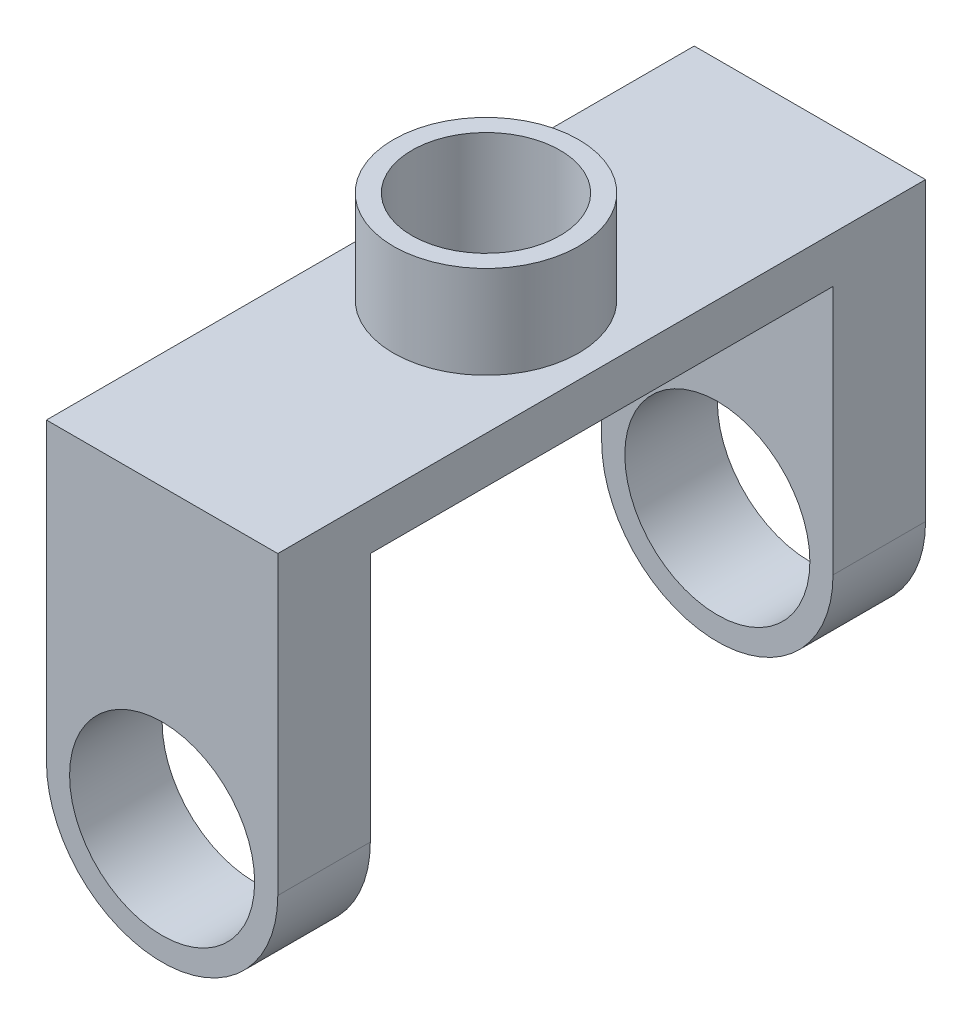
ISO-10303-21;
HEADER;
FILE_DESCRIPTION(('STEP AP214'),'2;1');
FILE_NAME('part.step','',(''),(''),'','','');
FILE_SCHEMA(('AUTOMOTIVE_DESIGN { 1 0 10303 214 1 1 1 1 }'));
ENDSEC;
DATA;
#1=APPLICATION_CONTEXT('core data for automotive mechanical design processes');
#2=APPLICATION_PROTOCOL_DEFINITION('international standard','automotive_design',2000,#1);
#3=PRODUCT_CONTEXT('',#1,'mechanical');
#4=PRODUCT('Part','Part','',(#3));
#5=PRODUCT_RELATED_PRODUCT_CATEGORY('part','',(#4));
#6=PRODUCT_DEFINITION_FORMATION('','',#4);
#7=PRODUCT_DEFINITION_CONTEXT('part definition',#1,'design');
#8=PRODUCT_DEFINITION('design','',#6,#7);
#9=PRODUCT_DEFINITION_SHAPE('','',#8);
#10=(LENGTH_UNIT() NAMED_UNIT(*) SI_UNIT(.MILLI.,.METRE.));
#11=(NAMED_UNIT(*) PLANE_ANGLE_UNIT() SI_UNIT($,.RADIAN.));
#12=(NAMED_UNIT(*) SI_UNIT($,.STERADIAN.) SOLID_ANGLE_UNIT());
#13=UNCERTAINTY_MEASURE_WITH_UNIT(LENGTH_MEASURE(1.E-05),#10,'distance_accuracy_value','');
#14=(GEOMETRIC_REPRESENTATION_CONTEXT(3) GLOBAL_UNCERTAINTY_ASSIGNED_CONTEXT((#13)) GLOBAL_UNIT_ASSIGNED_CONTEXT((#10,
#11,#12)) REPRESENTATION_CONTEXT('',''));
#15=CARTESIAN_POINT('',(0.,0.,0.));
#16=DIRECTION('',(0.,0.,1.));
#17=DIRECTION('',(1.,0.,0.));
#18=AXIS2_PLACEMENT_3D('',#15,#16,#17);
#19=CARTESIAN_POINT('',(0.,0.,3.5));
#20=DIRECTION('',(0.,0.,-1.));
#21=DIRECTION('',(-1.,0.,0.));
#22=AXIS2_PLACEMENT_3D('',#19,#20,#21);
#23=CYLINDRICAL_SURFACE('',#22,1.25);
#24=DIRECTION('',(0.,0.,-1.));
#25=VECTOR('',#24,1.);
#26=CARTESIAN_POINT('',(1.25,0.,3.5));
#27=LINE('',#26,#25);
#28=CARTESIAN_POINT('',(1.25,0.,-2.5));
#29=VERTEX_POINT('',#28);
#30=CARTESIAN_POINT('',(1.25,0.,-3.5));
#31=VERTEX_POINT('',#30);
#32=EDGE_CURVE('E178',#29,#31,#27,.T.);
#33=ORIENTED_EDGE('',*,*,#32,.F.);
#34=CARTESIAN_POINT('',(0.,0.,-2.5));
#35=DIRECTION('',(0.,0.,-1.));
#36=DIRECTION('',(-1.,0.,0.));
#37=AXIS2_PLACEMENT_3D('',#34,#35,#36);
#38=CIRCLE('',#37,1.25);
#39=CARTESIAN_POINT('',(-1.25,0.,-2.5));
#40=VERTEX_POINT('',#39);
#41=EDGE_CURVE('E144',#29,#40,#38,.T.);
#42=ORIENTED_EDGE('',*,*,#41,.T.);
#43=DIRECTION('',(0.,0.,-1.));
#44=VECTOR('',#43,1.);
#45=CARTESIAN_POINT('',(-1.25,0.,3.5));
#46=LINE('',#45,#44);
#47=CARTESIAN_POINT('',(-1.25,0.,-3.5));
#48=VERTEX_POINT('',#47);
#49=EDGE_CURVE('E85',#40,#48,#46,.T.);
#50=ORIENTED_EDGE('',*,*,#49,.T.);
#51=CARTESIAN_POINT('',(0.,0.,-3.5));
#52=DIRECTION('',(0.,0.,1.));
#53=DIRECTION('',(1.,0.,0.));
#54=AXIS2_PLACEMENT_3D('',#51,#52,#53);
#55=CIRCLE('',#54,1.25);
#56=EDGE_CURVE('E151',#48,#31,#55,.T.);
#57=ORIENTED_EDGE('',*,*,#56,.T.);
#58=EDGE_LOOP('',(#33,#42,#50,#57));
#59=FACE_BOUND('',#58,.T.);
#60=ADVANCED_FACE('F37',(#59),#23,.T.);
#61=CARTESIAN_POINT('',(0.,0.,-3.5));
#62=DIRECTION('',(0.,0.,1.));
#63=DIRECTION('',(1.,0.,0.));
#64=AXIS2_PLACEMENT_3D('',#61,#62,#63);
#65=CYLINDRICAL_SURFACE('',#64,1.);
#66=CARTESIAN_POINT('',(0.,0.,-2.5));
#67=DIRECTION('',(0.,0.,-1.));
#68=DIRECTION('',(-1.,0.,0.));
#69=AXIS2_PLACEMENT_3D('',#66,#67,#68);
#70=CIRCLE('',#69,1.);
#71=CARTESIAN_POINT('',(-1.,0.,-2.5));
#72=VERTEX_POINT('',#71);
#73=EDGE_CURVE('E41',#72,#72,#70,.F.);
#74=ORIENTED_EDGE('',*,*,#73,.T.);
#75=EDGE_LOOP('',(#74));
#76=FACE_BOUND('',#75,.T.);
#77=CARTESIAN_POINT('',(0.,0.,-3.5));
#78=DIRECTION('',(0.,0.,1.));
#79=DIRECTION('',(1.,0.,0.));
#80=AXIS2_PLACEMENT_3D('',#77,#78,#79);
#81=CIRCLE('',#80,1.);
#82=CARTESIAN_POINT('',(1.,0.,-3.5));
#83=VERTEX_POINT('',#82);
#84=EDGE_CURVE('E148',#83,#83,#81,.T.);
#85=ORIENTED_EDGE('',*,*,#84,.F.);
#86=EDGE_LOOP('',(#85));
#87=FACE_BOUND('',#86,.T.);
#88=ADVANCED_FACE('F200',(#76,#87),#65,.F.);
#89=CARTESIAN_POINT('',(0.,0.,2.5));
#90=DIRECTION('',(0.,0.,1.));
#91=DIRECTION('',(0.,-1.,0.));
#92=AXIS2_PLACEMENT_3D('',#89,#90,#91);
#93=CIRCLE('',#92,1.25);
#94=CARTESIAN_POINT('',(-1.25,0.,2.5));
#95=VERTEX_POINT('',#94);
#96=CARTESIAN_POINT('',(1.25,0.,2.5));
#97=VERTEX_POINT('',#96);
#98=EDGE_CURVE('E54',#95,#97,#93,.T.);
#99=ORIENTED_EDGE('',*,*,#98,.T.);
#100=CARTESIAN_POINT('',(1.25,0.,3.5));
#101=VERTEX_POINT('',#100);
#102=EDGE_CURVE('E46',#101,#97,#27,.T.);
#103=ORIENTED_EDGE('',*,*,#102,.F.);
#104=CARTESIAN_POINT('',(0.,0.,3.5));
#105=DIRECTION('',(0.,0.,1.));
#106=DIRECTION('',(1.,0.,0.));
#107=AXIS2_PLACEMENT_3D('',#104,#105,#106);
#108=CIRCLE('',#107,1.25);
#109=CARTESIAN_POINT('',(-1.25,0.,3.5));
#110=VERTEX_POINT('',#109);
#111=EDGE_CURVE('E92',#110,#101,#108,.T.);
#112=ORIENTED_EDGE('',*,*,#111,.F.);
#113=EDGE_CURVE('E62',#110,#95,#46,.T.);
#114=ORIENTED_EDGE('',*,*,#113,.T.);
#115=EDGE_LOOP('',(#99,#103,#112,#114));
#116=FACE_BOUND('',#115,.T.);
#117=ADVANCED_FACE('F39',(#116),#23,.T.);
#118=CARTESIAN_POINT('',(1.25,3.2,3.5));
#119=DIRECTION('',(1.,0.,0.));
#120=DIRECTION('',(0.,0.,-1.));
#121=AXIS2_PLACEMENT_3D('',#118,#119,#120);
#122=PLANE('',#121);
#123=DIRECTION('',(0.,1.,0.));
#124=VECTOR('',#123,1.);
#125=CARTESIAN_POINT('',(1.25,3.2,-2.5));
#126=LINE('',#125,#124);
#127=CARTESIAN_POINT('',(1.25,2.7,-2.5));
#128=VERTEX_POINT('',#127);
#129=EDGE_CURVE('E142',#29,#128,#126,.T.);
#130=ORIENTED_EDGE('',*,*,#129,.F.);
#131=ORIENTED_EDGE('',*,*,#32,.T.);
#132=DIRECTION('',(0.,-1.,0.));
#133=VECTOR('',#132,1.);
#134=CARTESIAN_POINT('',(1.25,3.2,-3.5));
#135=LINE('',#134,#133);
#136=CARTESIAN_POINT('',(1.25,3.2,-3.5));
#137=VERTEX_POINT('',#136);
#138=EDGE_CURVE('E165',#137,#31,#135,.T.);
#139=ORIENTED_EDGE('',*,*,#138,.F.);
#140=DIRECTION('',(0.,0.,-1.));
#141=VECTOR('',#140,1.);
#142=CARTESIAN_POINT('',(1.25,3.2,3.5));
#143=LINE('',#142,#141);
#144=CARTESIAN_POINT('',(1.25,3.2,3.5));
#145=VERTEX_POINT('',#144);
#146=EDGE_CURVE('E176',#145,#137,#143,.T.);
#147=ORIENTED_EDGE('',*,*,#146,.F.);
#148=DIRECTION('',(0.,-1.,0.));
#149=VECTOR('',#148,1.);
#150=CARTESIAN_POINT('',(1.25,3.2,3.5));
#151=LINE('',#150,#149);
#152=EDGE_CURVE('E155',#145,#101,#151,.T.);
#153=ORIENTED_EDGE('',*,*,#152,.T.);
#154=ORIENTED_EDGE('',*,*,#102,.T.);
#155=DIRECTION('',(0.,-1.,0.));
#156=VECTOR('',#155,1.);
#157=CARTESIAN_POINT('',(1.25,3.2,2.5));
#158=LINE('',#157,#156);
#159=CARTESIAN_POINT('',(1.25,2.7,2.5));
#160=VERTEX_POINT('',#159);
#161=EDGE_CURVE('E139',#160,#97,#158,.T.);
#162=ORIENTED_EDGE('',*,*,#161,.F.);
#163=DIRECTION('',(0.,0.,1.));
#164=VECTOR('',#163,1.);
#165=CARTESIAN_POINT('',(1.25,2.7,3.5));
#166=LINE('',#165,#164);
#167=EDGE_CURVE('E123',#128,#160,#166,.T.);
#168=ORIENTED_EDGE('',*,*,#167,.F.);
#169=EDGE_LOOP('',(#130,#131,#139,#147,#153,#154,#162,#168));
#170=FACE_BOUND('',#169,.T.);
#171=ADVANCED_FACE('F207',(#170),#122,.T.);
#172=CARTESIAN_POINT('',(-1.25,3.2,3.5));
#173=DIRECTION('',(0.,1.,0.));
#174=DIRECTION('',(0.,0.,1.));
#175=AXIS2_PLACEMENT_3D('',#172,#173,#174);
#176=PLANE('',#175);
#177=CARTESIAN_POINT('',(0.,3.2,0.));
#178=DIRECTION('',(0.,1.,0.));
#179=DIRECTION('',(0.,0.,1.));
#180=AXIS2_PLACEMENT_3D('',#177,#178,#179);
#181=CIRCLE('',#180,1.);
#182=CARTESIAN_POINT('',(0.,3.2,1.));
#183=VERTEX_POINT('',#182);
#184=EDGE_CURVE('E11',#183,#183,#181,.T.);
#185=ORIENTED_EDGE('',*,*,#184,.F.);
#186=EDGE_LOOP('',(#185));
#187=FACE_BOUND('',#186,.T.);
#188=DIRECTION('',(1.,0.,0.));
#189=VECTOR('',#188,1.);
#190=CARTESIAN_POINT('',(-1.25,3.2,-3.5));
#191=LINE('',#190,#189);
#192=CARTESIAN_POINT('',(-1.25,3.2,-3.5));
#193=VERTEX_POINT('',#192);
#194=EDGE_CURVE('E168',#193,#137,#191,.T.);
#195=ORIENTED_EDGE('',*,*,#194,.F.);
#196=DIRECTION('',(0.,0.,-1.));
#197=VECTOR('',#196,1.);
#198=CARTESIAN_POINT('',(-1.25,3.2,3.5));
#199=LINE('',#198,#197);
#200=CARTESIAN_POINT('',(-1.25,3.2,3.5));
#201=VERTEX_POINT('',#200);
#202=EDGE_CURVE('E174',#201,#193,#199,.T.);
#203=ORIENTED_EDGE('',*,*,#202,.F.);
#204=DIRECTION('',(1.,0.,0.));
#205=VECTOR('',#204,1.);
#206=CARTESIAN_POINT('',(-1.25,3.2,3.5));
#207=LINE('',#206,#205);
#208=EDGE_CURVE('E159',#201,#145,#207,.T.);
#209=ORIENTED_EDGE('',*,*,#208,.T.);
#210=ORIENTED_EDGE('',*,*,#146,.T.);
#211=EDGE_LOOP('',(#195,#203,#209,#210));
#212=FACE_BOUND('',#211,.T.);
#213=ADVANCED_FACE('F212',(#187,#212),#176,.T.);
#214=CARTESIAN_POINT('',(-1.25,0.,3.5));
#215=DIRECTION('',(-1.,0.,0.));
#216=DIRECTION('',(0.,0.,1.));
#217=AXIS2_PLACEMENT_3D('',#214,#215,#216);
#218=PLANE('',#217);
#219=DIRECTION('',(0.,-1.,0.));
#220=VECTOR('',#219,1.);
#221=CARTESIAN_POINT('',(-1.25,-1.25,-2.5));
#222=LINE('',#221,#220);
#223=CARTESIAN_POINT('',(-1.25,2.7,-2.5));
#224=VERTEX_POINT('',#223);
#225=EDGE_CURVE('E126',#224,#40,#222,.T.);
#226=ORIENTED_EDGE('',*,*,#225,.F.);
#227=DIRECTION('',(0.,0.,-1.));
#228=VECTOR('',#227,1.);
#229=CARTESIAN_POINT('',(-1.25,2.7,-2.5));
#230=LINE('',#229,#228);
#231=CARTESIAN_POINT('',(-1.25,2.7,2.5));
#232=VERTEX_POINT('',#231);
#233=EDGE_CURVE('E120',#232,#224,#230,.T.);
#234=ORIENTED_EDGE('',*,*,#233,.F.);
#235=DIRECTION('',(0.,1.,0.));
#236=VECTOR('',#235,1.);
#237=CARTESIAN_POINT('',(-1.25,2.7,2.5));
#238=LINE('',#237,#236);
#239=EDGE_CURVE('E128',#95,#232,#238,.T.);
#240=ORIENTED_EDGE('',*,*,#239,.F.);
#241=ORIENTED_EDGE('',*,*,#113,.F.);
#242=DIRECTION('',(0.,1.,0.));
#243=VECTOR('',#242,1.);
#244=CARTESIAN_POINT('',(-1.25,0.,3.5));
#245=LINE('',#244,#243);
#246=EDGE_CURVE('E162',#110,#201,#245,.T.);
#247=ORIENTED_EDGE('',*,*,#246,.T.);
#248=ORIENTED_EDGE('',*,*,#202,.T.);
#249=DIRECTION('',(0.,1.,0.));
#250=VECTOR('',#249,1.);
#251=CARTESIAN_POINT('',(-1.25,0.,-3.5));
#252=LINE('',#251,#250);
#253=EDGE_CURVE('E156',#48,#193,#252,.T.);
#254=ORIENTED_EDGE('',*,*,#253,.F.);
#255=ORIENTED_EDGE('',*,*,#49,.F.);
#256=EDGE_LOOP('',(#226,#234,#240,#241,#247,#248,#254,#255));
#257=FACE_BOUND('',#256,.T.);
#258=ADVANCED_FACE('F132',(#257),#218,.T.);
#259=CARTESIAN_POINT('',(0.,0.,3.5));
#260=DIRECTION('',(0.,0.,1.));
#261=DIRECTION('',(1.,0.,0.));
#262=AXIS2_PLACEMENT_3D('',#259,#260,#261);
#263=PLANE('',#262);
#264=CARTESIAN_POINT('',(0.,0.,3.5));
#265=DIRECTION('',(0.,0.,1.));
#266=DIRECTION('',(1.,0.,0.));
#267=AXIS2_PLACEMENT_3D('',#264,#265,#266);
#268=CIRCLE('',#267,1.);
#269=CARTESIAN_POINT('',(1.,0.,3.5));
#270=VERTEX_POINT('',#269);
#271=EDGE_CURVE('E147',#270,#270,#268,.T.);
#272=ORIENTED_EDGE('',*,*,#271,.F.);
#273=EDGE_LOOP('',(#272));
#274=FACE_BOUND('',#273,.T.);
#275=ORIENTED_EDGE('',*,*,#111,.T.);
#276=ORIENTED_EDGE('',*,*,#152,.F.);
#277=ORIENTED_EDGE('',*,*,#208,.F.);
#278=ORIENTED_EDGE('',*,*,#246,.F.);
#279=EDGE_LOOP('',(#275,#276,#277,#278));
#280=FACE_BOUND('',#279,.T.);
#281=ADVANCED_FACE('F217',(#274,#280),#263,.T.);
#282=CARTESIAN_POINT('',(0.,0.,-3.5));
#283=DIRECTION('',(0.,0.,1.));
#284=DIRECTION('',(1.,0.,0.));
#285=AXIS2_PLACEMENT_3D('',#282,#283,#284);
#286=PLANE('',#285);
#287=ORIENTED_EDGE('',*,*,#84,.T.);
#288=EDGE_LOOP('',(#287));
#289=FACE_BOUND('',#288,.T.);
#290=ORIENTED_EDGE('',*,*,#56,.F.);
#291=ORIENTED_EDGE('',*,*,#253,.T.);
#292=ORIENTED_EDGE('',*,*,#194,.T.);
#293=ORIENTED_EDGE('',*,*,#138,.T.);
#294=EDGE_LOOP('',(#290,#291,#292,#293));
#295=FACE_BOUND('',#294,.T.);
#296=ADVANCED_FACE('F222',(#289,#295),#286,.F.);
#297=CARTESIAN_POINT('',(0.,0.,2.5));
#298=DIRECTION('',(0.,0.,1.));
#299=DIRECTION('',(0.,-1.,0.));
#300=AXIS2_PLACEMENT_3D('',#297,#298,#299);
#301=CIRCLE('',#300,1.);
#302=CARTESIAN_POINT('',(0.,-1.,2.5));
#303=VERTEX_POINT('',#302);
#304=EDGE_CURVE('E137',#303,#303,#301,.F.);
#305=ORIENTED_EDGE('',*,*,#304,.T.);
#306=EDGE_LOOP('',(#305));
#307=FACE_BOUND('',#306,.T.);
#308=ORIENTED_EDGE('',*,*,#271,.T.);
#309=EDGE_LOOP('',(#308));
#310=FACE_BOUND('',#309,.T.);
#311=ADVANCED_FACE('F183',(#307,#310),#65,.F.);
#312=CARTESIAN_POINT('',(4.75,-1.25,-2.5));
#313=DIRECTION('',(0.,0.,-1.));
#314=DIRECTION('',(-1.,0.,0.));
#315=AXIS2_PLACEMENT_3D('',#312,#313,#314);
#316=PLANE('',#315);
#317=ORIENTED_EDGE('',*,*,#73,.F.);
#318=EDGE_LOOP('',(#317));
#319=FACE_BOUND('',#318,.T.);
#320=ORIENTED_EDGE('',*,*,#41,.F.);
#321=ORIENTED_EDGE('',*,*,#129,.T.);
#322=DIRECTION('',(-1.,0.,0.));
#323=VECTOR('',#322,1.);
#324=CARTESIAN_POINT('',(4.75,2.7,-2.5));
#325=LINE('',#324,#323);
#326=EDGE_CURVE('E125',#128,#224,#325,.T.);
#327=ORIENTED_EDGE('',*,*,#326,.T.);
#328=ORIENTED_EDGE('',*,*,#225,.T.);
#329=EDGE_LOOP('',(#320,#321,#327,#328));
#330=FACE_BOUND('',#329,.T.);
#331=ADVANCED_FACE('F187',(#319,#330),#316,.F.);
#332=CARTESIAN_POINT('',(4.75,2.7,2.5));
#333=DIRECTION('',(0.,0.,1.));
#334=DIRECTION('',(0.,-1.,0.));
#335=AXIS2_PLACEMENT_3D('',#332,#333,#334);
#336=PLANE('',#335);
#337=ORIENTED_EDGE('',*,*,#304,.F.);
#338=EDGE_LOOP('',(#337));
#339=FACE_BOUND('',#338,.T.);
#340=ORIENTED_EDGE('',*,*,#239,.T.);
#341=DIRECTION('',(-1.,0.,0.));
#342=VECTOR('',#341,1.);
#343=CARTESIAN_POINT('',(4.75,2.7,2.5));
#344=LINE('',#343,#342);
#345=EDGE_CURVE('E116',#160,#232,#344,.T.);
#346=ORIENTED_EDGE('',*,*,#345,.F.);
#347=ORIENTED_EDGE('',*,*,#161,.T.);
#348=ORIENTED_EDGE('',*,*,#98,.F.);
#349=EDGE_LOOP('',(#340,#346,#347,#348));
#350=FACE_BOUND('',#349,.T.);
#351=ADVANCED_FACE('F129',(#339,#350),#336,.F.);
#352=CARTESIAN_POINT('',(4.75,2.7,-2.5));
#353=DIRECTION('',(0.,1.,0.));
#354=DIRECTION('',(0.,0.,1.));
#355=AXIS2_PLACEMENT_3D('',#352,#353,#354);
#356=PLANE('',#355);
#357=CARTESIAN_POINT('',(0.,2.7,0.));
#358=DIRECTION('',(0.,1.,0.));
#359=DIRECTION('',(0.,0.,1.));
#360=AXIS2_PLACEMENT_3D('',#357,#358,#359);
#361=CIRCLE('',#360,0.8);
#362=CARTESIAN_POINT('',(0.,2.7,0.8));
#363=VERTEX_POINT('',#362);
#364=EDGE_CURVE('E264',#363,#363,#361,.T.);
#365=ORIENTED_EDGE('',*,*,#364,.T.);
#366=EDGE_LOOP('',(#365));
#367=FACE_BOUND('',#366,.T.);
#368=ORIENTED_EDGE('',*,*,#167,.T.);
#369=ORIENTED_EDGE('',*,*,#345,.T.);
#370=ORIENTED_EDGE('',*,*,#233,.T.);
#371=ORIENTED_EDGE('',*,*,#326,.F.);
#372=EDGE_LOOP('',(#368,#369,#370,#371));
#373=FACE_BOUND('',#372,.T.);
#374=ADVANCED_FACE('F117',(#367,#373),#356,.F.);
#375=CARTESIAN_POINT('',(0.,4.2,0.));
#376=DIRECTION('',(0.,-1.,0.));
#377=DIRECTION('',(0.,0.,-1.));
#378=AXIS2_PLACEMENT_3D('',#375,#376,#377);
#379=CYLINDRICAL_SURFACE('',#378,1.);
#380=CARTESIAN_POINT('',(0.,4.2,0.));
#381=DIRECTION('',(0.,1.,0.));
#382=DIRECTION('',(0.,0.,1.));
#383=AXIS2_PLACEMENT_3D('',#380,#381,#382);
#384=CIRCLE('',#383,1.);
#385=CARTESIAN_POINT('',(0.,4.2,1.));
#386=VERTEX_POINT('',#385);
#387=EDGE_CURVE('E130',#386,#386,#384,.T.);
#388=ORIENTED_EDGE('',*,*,#387,.F.);
#389=EDGE_LOOP('',(#388));
#390=FACE_BOUND('',#389,.T.);
#391=ORIENTED_EDGE('',*,*,#184,.T.);
#392=EDGE_LOOP('',(#391));
#393=FACE_BOUND('',#392,.T.);
#394=ADVANCED_FACE('F193',(#390,#393),#379,.T.);
#395=CARTESIAN_POINT('',(0.,4.2,0.));
#396=DIRECTION('',(0.,1.,0.));
#397=DIRECTION('',(0.,0.,1.));
#398=AXIS2_PLACEMENT_3D('',#395,#396,#397);
#399=PLANE('',#398);
#400=CARTESIAN_POINT('',(0.,4.2,0.));
#401=DIRECTION('',(0.,1.,0.));
#402=DIRECTION('',(0.,0.,1.));
#403=AXIS2_PLACEMENT_3D('',#400,#401,#402);
#404=CIRCLE('',#403,0.8);
#405=CARTESIAN_POINT('',(0.,4.2,0.8));
#406=VERTEX_POINT('',#405);
#407=EDGE_CURVE('E261',#406,#406,#404,.T.);
#408=ORIENTED_EDGE('',*,*,#407,.F.);
#409=EDGE_LOOP('',(#408));
#410=FACE_BOUND('',#409,.T.);
#411=ORIENTED_EDGE('',*,*,#387,.T.);
#412=EDGE_LOOP('',(#411));
#413=FACE_BOUND('',#412,.T.);
#414=ADVANCED_FACE('F243',(#410,#413),#399,.T.);
#415=CARTESIAN_POINT('',(0.,2.2,0.));
#416=DIRECTION('',(0.,1.,0.));
#417=DIRECTION('',(0.,0.,1.));
#418=AXIS2_PLACEMENT_3D('',#415,#416,#417);
#419=CYLINDRICAL_SURFACE('',#418,0.8);
#420=ORIENTED_EDGE('',*,*,#407,.T.);
#421=EDGE_LOOP('',(#420));
#422=FACE_BOUND('',#421,.T.);
#423=ORIENTED_EDGE('',*,*,#364,.F.);
#424=EDGE_LOOP('',(#423));
#425=FACE_BOUND('',#424,.T.);
#426=ADVANCED_FACE('F249',(#422,#425),#419,.F.);
#427=CLOSED_SHELL('',(#60,#88,#117,#171,#213,#258,#281,#296,#311,#331,#351,#374,#394,#414,#426));
#428=MANIFOLD_SOLID_BREP('B2',#427);
#429=ADVANCED_BREP_SHAPE_REPRESENTATION('',(#18,#428),#14);
#430=SHAPE_DEFINITION_REPRESENTATION(#9,#429);
ENDSEC;
END-ISO-10303-21;
